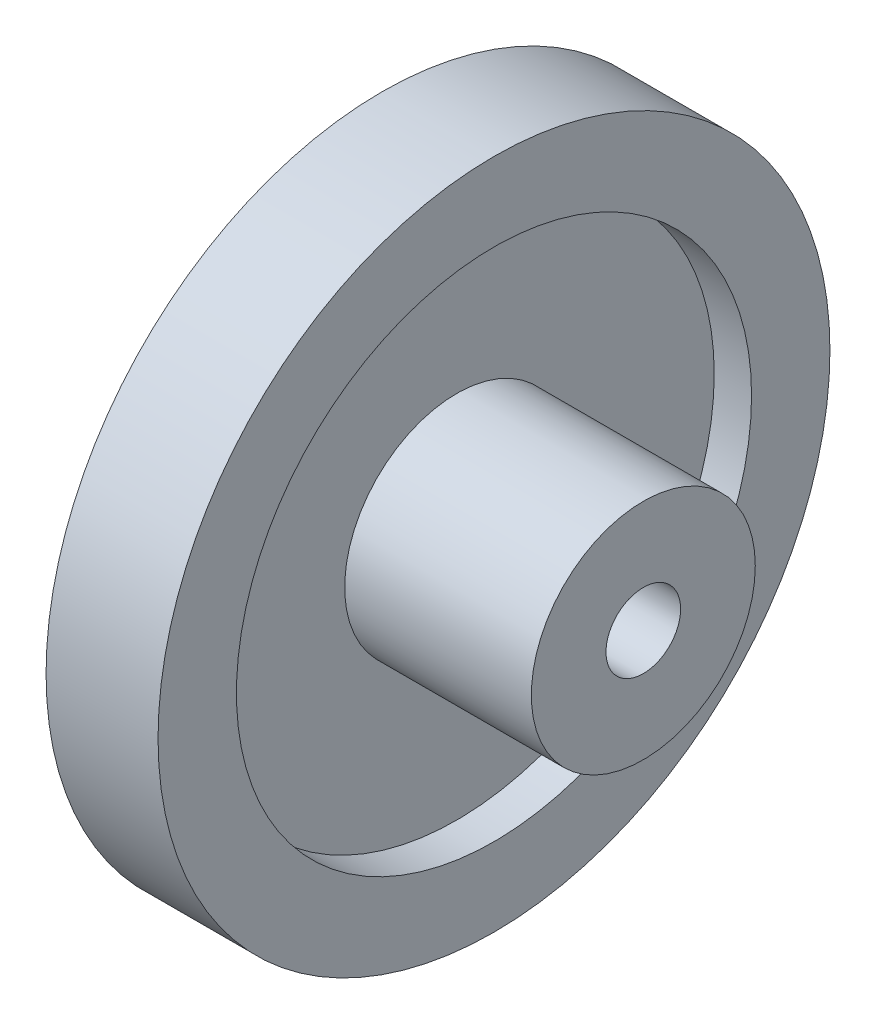
ISO-10303-21;
HEADER;
FILE_DESCRIPTION(('STEP AP214'),'2;1');
FILE_NAME('part.step','',(''),(''),'','','');
FILE_SCHEMA(('AUTOMOTIVE_DESIGN { 1 0 10303 214 1 1 1 1 }'));
ENDSEC;
DATA;
#1=APPLICATION_CONTEXT('core data for automotive mechanical design processes');
#2=APPLICATION_PROTOCOL_DEFINITION('international standard','automotive_design',2000,#1);
#3=PRODUCT_CONTEXT('',#1,'mechanical');
#4=PRODUCT('Part','Part','',(#3));
#5=PRODUCT_RELATED_PRODUCT_CATEGORY('part','',(#4));
#6=PRODUCT_DEFINITION_FORMATION('','',#4);
#7=PRODUCT_DEFINITION_CONTEXT('part definition',#1,'design');
#8=PRODUCT_DEFINITION('design','',#6,#7);
#9=PRODUCT_DEFINITION_SHAPE('','',#8);
#10=(LENGTH_UNIT() NAMED_UNIT(*) SI_UNIT(.MILLI.,.METRE.));
#11=(NAMED_UNIT(*) PLANE_ANGLE_UNIT() SI_UNIT($,.RADIAN.));
#12=(NAMED_UNIT(*) SI_UNIT($,.STERADIAN.) SOLID_ANGLE_UNIT());
#13=UNCERTAINTY_MEASURE_WITH_UNIT(LENGTH_MEASURE(1.E-05),#10,'distance_accuracy_value','');
#14=(GEOMETRIC_REPRESENTATION_CONTEXT(3) GLOBAL_UNCERTAINTY_ASSIGNED_CONTEXT((#13)) GLOBAL_UNIT_ASSIGNED_CONTEXT((#10,
#11,#12)) REPRESENTATION_CONTEXT('',''));
#15=CARTESIAN_POINT('',(0.,0.,0.));
#16=DIRECTION('',(0.,0.,1.));
#17=DIRECTION('',(1.,0.,0.));
#18=AXIS2_PLACEMENT_3D('',#15,#16,#17);
#19=CARTESIAN_POINT('',(2.,0.,0.));
#20=DIRECTION('',(1.,0.,0.));
#21=DIRECTION('',(0.,0.,-1.));
#22=AXIS2_PLACEMENT_3D('',#19,#20,#21);
#23=PLANE('',#22);
#24=CARTESIAN_POINT('',(2.,-1.73477898712804E-12,-3.90798504668055E-13));
#25=DIRECTION('',(1.,0.,0.));
#26=DIRECTION('',(0.,0.,-1.));
#27=AXIS2_PLACEMENT_3D('',#24,#25,#26);
#28=CIRCLE('',#27,2.99999999999843);
#29=CARTESIAN_POINT('',(2.,-1.73477898712804E-12,-2.99999999999883));
#30=VERTEX_POINT('',#29);
#31=EDGE_CURVE('E53',#30,#30,#28,.T.);
#32=ORIENTED_EDGE('',*,*,#31,.F.);
#33=EDGE_LOOP('',(#32));
#34=FACE_BOUND('',#33,.T.);
#35=CARTESIAN_POINT('',(2.,0.,0.));
#36=DIRECTION('',(1.,0.,0.));
#37=DIRECTION('',(0.,0.,-1.));
#38=AXIS2_PLACEMENT_3D('',#35,#36,#37);
#39=CIRCLE('',#38,6.9);
#40=CARTESIAN_POINT('',(2.,0.,-6.9));
#41=VERTEX_POINT('',#40);
#42=EDGE_CURVE('E46',#41,#41,#39,.T.);
#43=ORIENTED_EDGE('',*,*,#42,.T.);
#44=EDGE_LOOP('',(#43));
#45=FACE_BOUND('',#44,.T.);
#46=ADVANCED_FACE('F31',(#34,#45),#23,.T.);
#47=CARTESIAN_POINT('',(3.,0.,0.));
#48=DIRECTION('',(-1.,0.,0.));
#49=DIRECTION('',(0.,0.,1.));
#50=AXIS2_PLACEMENT_3D('',#47,#48,#49);
#51=CYLINDRICAL_SURFACE('',#50,1.);
#52=CARTESIAN_POINT('',(7.,-1.73477898712804E-12,-3.90798504668055E-13));
#53=DIRECTION('',(1.,0.,0.));
#54=DIRECTION('',(0.,0.,-1.));
#55=AXIS2_PLACEMENT_3D('',#52,#53,#54);
#56=CIRCLE('',#55,0.999999999998498);
#57=CARTESIAN_POINT('',(7.,-1.73477898712804E-12,-0.999999999998889));
#58=VERTEX_POINT('',#57);
#59=EDGE_CURVE('E56',#58,#58,#56,.T.);
#60=ORIENTED_EDGE('',*,*,#59,.T.);
#61=EDGE_LOOP('',(#60));
#62=FACE_BOUND('',#61,.T.);
#63=CARTESIAN_POINT('',(0.,0.,0.));
#64=DIRECTION('',(1.,0.,0.));
#65=DIRECTION('',(0.,0.,-1.));
#66=AXIS2_PLACEMENT_3D('',#63,#64,#65);
#67=CIRCLE('',#66,1.);
#68=CARTESIAN_POINT('',(0.,0.,-1.00000000000001));
#69=VERTEX_POINT('',#68);
#70=EDGE_CURVE('E42',#69,#69,#67,.T.);
#71=ORIENTED_EDGE('',*,*,#70,.F.);
#72=EDGE_LOOP('',(#71));
#73=FACE_BOUND('',#72,.T.);
#74=ADVANCED_FACE('F62',(#62,#73),#51,.F.);
#75=CARTESIAN_POINT('',(3.,0.129972733663192,-8.50768071599674));
#76=DIRECTION('',(-1.,0.,0.));
#77=DIRECTION('',(0.,0.,1.));
#78=AXIS2_PLACEMENT_3D('',#75,#76,#77);
#79=PLANE('',#78);
#80=CARTESIAN_POINT('',(3.,0.,0.));
#81=DIRECTION('',(1.,0.,0.));
#82=DIRECTION('',(0.,0.,-1.));
#83=AXIS2_PLACEMENT_3D('',#80,#81,#82);
#84=CIRCLE('',#83,9.);
#85=CARTESIAN_POINT('',(3.,0.,-9.00000000000001));
#86=VERTEX_POINT('',#85);
#87=EDGE_CURVE('E10',#86,#86,#84,.T.);
#88=ORIENTED_EDGE('',*,*,#87,.T.);
#89=EDGE_LOOP('',(#88));
#90=FACE_BOUND('',#89,.T.);
#91=CARTESIAN_POINT('',(3.,0.,0.));
#92=DIRECTION('',(1.,0.,0.));
#93=DIRECTION('',(0.,0.,-1.));
#94=AXIS2_PLACEMENT_3D('',#91,#92,#93);
#95=CIRCLE('',#94,6.9);
#96=CARTESIAN_POINT('',(3.,0.,-6.9));
#97=VERTEX_POINT('',#96);
#98=EDGE_CURVE('E47',#97,#97,#95,.T.);
#99=ORIENTED_EDGE('',*,*,#98,.F.);
#100=EDGE_LOOP('',(#99));
#101=FACE_BOUND('',#100,.T.);
#102=ADVANCED_FACE('F85',(#90,#101),#79,.F.);
#103=CARTESIAN_POINT('',(0.,0.129972733663192,-8.50768071599674));
#104=DIRECTION('',(-1.,0.,0.));
#105=DIRECTION('',(0.,0.,1.));
#106=AXIS2_PLACEMENT_3D('',#103,#104,#105);
#107=PLANE('',#106);
#108=CARTESIAN_POINT('',(0.,0.,0.));
#109=DIRECTION('',(1.,0.,0.));
#110=DIRECTION('',(0.,0.,-1.));
#111=AXIS2_PLACEMENT_3D('',#108,#109,#110);
#112=CIRCLE('',#111,8.99999999999999);
#113=CARTESIAN_POINT('',(0.,0.,-8.99999999999999));
#114=VERTEX_POINT('',#113);
#115=EDGE_CURVE('E35',#114,#114,#112,.T.);
#116=ORIENTED_EDGE('',*,*,#115,.F.);
#117=EDGE_LOOP('',(#116));
#118=FACE_BOUND('',#117,.T.);
#119=ORIENTED_EDGE('',*,*,#70,.T.);
#120=EDGE_LOOP('',(#119));
#121=FACE_BOUND('',#120,.T.);
#122=ADVANCED_FACE('F91',(#118,#121),#107,.T.);
#123=CARTESIAN_POINT('',(3.,0.,0.));
#124=DIRECTION('',(-1.,0.,0.));
#125=DIRECTION('',(0.,0.,1.));
#126=AXIS2_PLACEMENT_3D('',#123,#124,#125);
#127=CYLINDRICAL_SURFACE('',#126,8.99999999999999);
#128=ORIENTED_EDGE('',*,*,#115,.T.);
#129=EDGE_LOOP('',(#128));
#130=FACE_BOUND('',#129,.T.);
#131=ORIENTED_EDGE('',*,*,#87,.F.);
#132=EDGE_LOOP('',(#131));
#133=FACE_BOUND('',#132,.T.);
#134=ADVANCED_FACE('F33',(#130,#133),#127,.T.);
#135=CARTESIAN_POINT('',(2.,0.,0.));
#136=DIRECTION('',(1.,0.,0.));
#137=DIRECTION('',(0.,0.,-1.));
#138=AXIS2_PLACEMENT_3D('',#135,#136,#137);
#139=CYLINDRICAL_SURFACE('',#138,6.9);
#140=ORIENTED_EDGE('',*,*,#42,.F.);
#141=EDGE_LOOP('',(#140));
#142=FACE_BOUND('',#141,.T.);
#143=ORIENTED_EDGE('',*,*,#98,.T.);
#144=EDGE_LOOP('',(#143));
#145=FACE_BOUND('',#144,.T.);
#146=ADVANCED_FACE('F68',(#142,#145),#139,.F.);
#147=CARTESIAN_POINT('',(7.,-0.00200455213729739,-2.08425656763246));
#148=DIRECTION('',(1.,0.,0.));
#149=DIRECTION('',(0.,0.,-1.));
#150=AXIS2_PLACEMENT_3D('',#147,#148,#149);
#151=PLANE('',#150);
#152=CARTESIAN_POINT('',(7.,-1.73477898712804E-12,-3.90798504668055E-13));
#153=DIRECTION('',(1.,0.,0.));
#154=DIRECTION('',(0.,0.,-1.));
#155=AXIS2_PLACEMENT_3D('',#152,#153,#154);
#156=CIRCLE('',#155,2.99999999999843);
#157=CARTESIAN_POINT('',(7.,-1.73477898712804E-12,-2.99999999999883));
#158=VERTEX_POINT('',#157);
#159=EDGE_CURVE('E50',#158,#158,#156,.T.);
#160=ORIENTED_EDGE('',*,*,#159,.T.);
#161=EDGE_LOOP('',(#160));
#162=FACE_BOUND('',#161,.T.);
#163=ORIENTED_EDGE('',*,*,#59,.F.);
#164=EDGE_LOOP('',(#163));
#165=FACE_BOUND('',#164,.T.);
#166=ADVANCED_FACE('F65',(#162,#165),#151,.T.);
#167=CARTESIAN_POINT('',(7.,-1.73477898712804E-12,-3.90798504668055E-13));
#168=DIRECTION('',(-1.,0.,0.));
#169=DIRECTION('',(0.,0.,1.));
#170=AXIS2_PLACEMENT_3D('',#167,#168,#169);
#171=CYLINDRICAL_SURFACE('',#170,2.99999999999843);
#172=ORIENTED_EDGE('',*,*,#31,.T.);
#173=EDGE_LOOP('',(#172));
#174=FACE_BOUND('',#173,.T.);
#175=ORIENTED_EDGE('',*,*,#159,.F.);
#176=EDGE_LOOP('',(#175));
#177=FACE_BOUND('',#176,.T.);
#178=ADVANCED_FACE('F67',(#174,#177),#171,.T.);
#179=CLOSED_SHELL('',(#46,#74,#102,#122,#134,#146,#166,#178));
#180=MANIFOLD_SOLID_BREP('B2',#179);
#181=ADVANCED_BREP_SHAPE_REPRESENTATION('',(#18,#180),#14);
#182=SHAPE_DEFINITION_REPRESENTATION(#9,#181);
ENDSEC;
END-ISO-10303-21;
